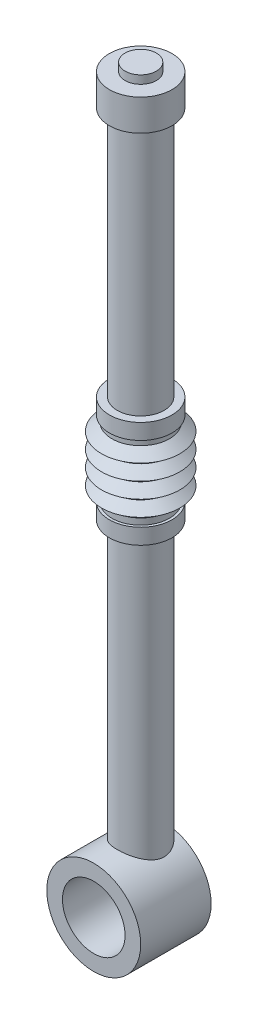
ISO-10303-21;
HEADER;
FILE_DESCRIPTION(('STEP AP214'),'2;1');
FILE_NAME('part.step','',(''),(''),'','','');
FILE_SCHEMA(('AUTOMOTIVE_DESIGN { 1 0 10303 214 1 1 1 1 }'));
ENDSEC;
DATA;
#1=APPLICATION_CONTEXT('core data for automotive mechanical design processes');
#2=APPLICATION_PROTOCOL_DEFINITION('international standard','automotive_design',2000,#1);
#3=PRODUCT_CONTEXT('',#1,'mechanical');
#4=PRODUCT('Part','Part','',(#3));
#5=PRODUCT_RELATED_PRODUCT_CATEGORY('part','',(#4));
#6=PRODUCT_DEFINITION_FORMATION('','',#4);
#7=PRODUCT_DEFINITION_CONTEXT('part definition',#1,'design');
#8=PRODUCT_DEFINITION('design','',#6,#7);
#9=PRODUCT_DEFINITION_SHAPE('','',#8);
#10=(LENGTH_UNIT() NAMED_UNIT(*) SI_UNIT(.MILLI.,.METRE.));
#11=(NAMED_UNIT(*) PLANE_ANGLE_UNIT() SI_UNIT($,.RADIAN.));
#12=(NAMED_UNIT(*) SI_UNIT($,.STERADIAN.) SOLID_ANGLE_UNIT());
#13=UNCERTAINTY_MEASURE_WITH_UNIT(LENGTH_MEASURE(1.E-05),#10,'distance_accuracy_value','');
#14=(GEOMETRIC_REPRESENTATION_CONTEXT(3) GLOBAL_UNCERTAINTY_ASSIGNED_CONTEXT((#13)) GLOBAL_UNIT_ASSIGNED_CONTEXT((#10,
#11,#12)) REPRESENTATION_CONTEXT('',''));
#15=CARTESIAN_POINT('',(0.,0.,0.));
#16=DIRECTION('',(0.,0.,1.));
#17=DIRECTION('',(1.,0.,0.));
#18=AXIS2_PLACEMENT_3D('',#15,#16,#17);
#19=CARTESIAN_POINT('',(0.,0.,-2.38125));
#20=DIRECTION('',(0.,0.,1.));
#21=DIRECTION('',(1.,0.,0.));
#22=AXIS2_PLACEMENT_3D('',#19,#20,#21);
#23=CYLINDRICAL_SURFACE('',#22,4.7625);
#24=CARTESIAN_POINT('',(0.,0.,4.7625));
#25=DIRECTION('',(0.,0.,1.));
#26=DIRECTION('',(1.,0.,0.));
#27=AXIS2_PLACEMENT_3D('',#24,#25,#26);
#28=CIRCLE('',#27,4.7625);
#29=CARTESIAN_POINT('',(4.7625,0.,4.7625));
#30=VERTEX_POINT('',#29);
#31=EDGE_CURVE('E50',#30,#30,#28,.T.);
#32=ORIENTED_EDGE('',*,*,#31,.F.);
#33=EDGE_LOOP('',(#32));
#34=FACE_BOUND('',#33,.T.);
#35=CARTESIAN_POINT('',(0.,0.,-2.38125));
#36=DIRECTION('',(0.,0.,1.));
#37=DIRECTION('',(1.,0.,0.));
#38=AXIS2_PLACEMENT_3D('',#35,#36,#37);
#39=CIRCLE('',#38,4.7625);
#40=CARTESIAN_POINT('',(0.,4.7625,-2.38125));
#41=VERTEX_POINT('',#40);
#42=EDGE_CURVE('E11',#41,#41,#39,.T.);
#43=ORIENTED_EDGE('',*,*,#42,.T.);
#44=CARTESIAN_POINT('',(0.,4.7625,2.38125));
#45=CARTESIAN_POINT('',(-0.125183914923426,4.76249216616824,2.38124079022415));
#46=CARTESIAN_POINT('',(-0.250522391801445,4.75751079676351,2.37131965241024));
#47=CARTESIAN_POINT('',(-0.497492135528296,4.73807236179371,2.33207069034315));
#48=CARTESIAN_POINT('',(-0.61911590225731,4.72359730146256,2.30270601091892));
#49=CARTESIAN_POINT('',(-0.854710283828683,4.68668758103659,2.2260071468603));
#50=CARTESIAN_POINT('',(-0.968708640458038,4.66428387601664,2.17874279663695));
#51=CARTESIAN_POINT('',(-1.18698797780686,4.6135713226785,2.06794748374516));
#52=CARTESIAN_POINT('',(-1.29126972381591,4.58526293998811,2.0044178036293));
#53=CARTESIAN_POINT('',(-1.49425297381025,4.52333339410727,1.8585245421104));
#54=CARTESIAN_POINT('',(-1.59223521685329,4.48949442770284,1.77525406928113));
#55=CARTESIAN_POINT('',(-1.77350605772424,4.42102804302336,1.59419572957401));
#56=CARTESIAN_POINT('',(-1.85678345855757,4.3864000463997,1.49639690352979));
#57=CARTESIAN_POINT('',(-2.01275632468803,4.31718127493204,1.27996152334087));
#58=CARTESIAN_POINT('',(-2.08413032991234,4.2828016396047,1.16029716565166));
#59=CARTESIAN_POINT('',(-2.2054380906532,4.22162236963736,0.90876278134485));
#60=CARTESIAN_POINT('',(-2.25538716198478,4.19481732492304,0.776901556021107));
#61=CARTESIAN_POINT('',(-2.32917787787114,4.1542779588081,0.512766217674418));
#62=CARTESIAN_POINT('',(-2.35440344714868,4.13985721707925,0.380989398503949));
#63=CARTESIAN_POINT('',(-2.38226677784078,4.12389375440723,0.114350392548179));
#64=CARTESIAN_POINT('',(-2.38492686044446,4.12233830748904,-0.0205086129467756));
#65=CARTESIAN_POINT('',(-2.36859910257368,4.13172902674897,-0.272143595403314));
#66=CARTESIAN_POINT('',(-2.35216198239562,4.14120243470123,-0.389153474350517));
#67=CARTESIAN_POINT('',(-2.30252551556825,4.16900269672528,-0.618462796693928));
#68=CARTESIAN_POINT('',(-2.26932082940667,4.1873323709318,-0.730760727258112));
#69=CARTESIAN_POINT('',(-2.18648703954377,4.23118303207826,-0.95066437192215));
#70=CARTESIAN_POINT('',(-2.13649337856986,4.25686158081143,-1.05809986210871));
#71=CARTESIAN_POINT('',(-2.02178051875954,4.31252481445096,-1.26357290922991));
#72=CARTESIAN_POINT('',(-1.95705470557847,4.3425114313283,-1.3616062166477));
#73=CARTESIAN_POINT('',(-1.80514479326104,4.40800707257198,-1.55857873309482));
#74=CARTESIAN_POINT('',(-1.71615367899184,4.44373421251251,-1.65605668020323));
#75=CARTESIAN_POINT('',(-1.5229417218779,4.51360277984095,-1.83531371551958));
#76=CARTESIAN_POINT('',(-1.41871364221752,4.54774344351895,-1.91708530103068));
#77=CARTESIAN_POINT('',(-1.19185492951209,4.61252857217558,-2.06617648032704));
#78=CARTESIAN_POINT('',(-1.06859448999609,4.6429370603578,-2.13264862501142));
#79=CARTESIAN_POINT('',(-0.810735175632698,4.69482204419958,-2.24336855040867));
#80=CARTESIAN_POINT('',(-0.676145403481687,4.71630562984336,-2.28763397806736));
#81=CARTESIAN_POINT('',(-0.411400208267049,4.74641069721793,-2.34904455510034));
#82=CARTESIAN_POINT('',(-0.281800769618209,4.75595009329994,-2.36813225512202));
#83=CARTESIAN_POINT('',(-0.0209064223793881,4.7642386329949,-2.384737891014));
#84=CARTESIAN_POINT('',(0.110387653565244,4.7629928883014,-2.38226604517899));
#85=CARTESIAN_POINT('',(0.360123514541608,4.75038401553492,-2.35694532320286));
#86=CARTESIAN_POINT('',(0.478772715418814,4.73981253794951,-2.33569065643669));
#87=CARTESIAN_POINT('',(0.710581412294078,4.71064045443463,-2.27590809129975));
#88=CARTESIAN_POINT('',(0.823740301552203,4.69203896333817,-2.23737828863266));
#89=CARTESIAN_POINT('',(1.04510349887023,4.64782498678607,-2.14312865180629));
#90=CARTESIAN_POINT('',(1.15307363286889,4.62202724713937,-2.08694881191042));
#91=CARTESIAN_POINT('',(1.35841111754757,4.56590338843347,-1.95951268074179));
#92=CARTESIAN_POINT('',(1.45577392465991,4.53557534193758,-1.88824996699537));
#93=CARTESIAN_POINT('',(1.64727181011511,4.46980202056836,-1.72459548718051));
#94=CARTESIAN_POINT('',(1.7401510102877,4.4341466953364,-1.63081604451219));
#95=CARTESIAN_POINT('',(1.90942036468315,4.36393570018444,-1.42892823352271));
#96=CARTESIAN_POINT('',(1.98579911229707,4.32938080496145,-1.32081003575388));
#97=CARTESIAN_POINT('',(2.12337947127906,4.2636565144193,-1.0866985484896));
#98=CARTESIAN_POINT('',(2.18366696159152,4.23273211084819,-0.960093172570528));
#99=CARTESIAN_POINT('',(2.28143472953946,4.18085759649541,-0.696491651629047));
#100=CARTESIAN_POINT('',(2.3189443944635,4.15989464137303,-0.559509152757374));
#101=CARTESIAN_POINT('',(2.36663314232661,4.13293324320619,-0.29310753161418));
#102=CARTESIAN_POINT('',(2.37909019428893,4.12569144386626,-0.164224683502319));
#103=CARTESIAN_POINT('',(2.3828910522584,4.12350000729882,0.0939333281807322));
#104=CARTESIAN_POINT('',(2.37424400991589,4.12854504196533,0.223208297429794));
#105=CARTESIAN_POINT('',(2.33821157512933,4.14903909044237,0.465495089724903));
#106=CARTESIAN_POINT('',(2.31268975773311,4.16345118862044,0.578883000588989));
#107=CARTESIAN_POINT('',(2.24593636258125,4.19983482171594,0.799643078320496));
#108=CARTESIAN_POINT('',(2.20469973139119,4.22180878809312,0.907013297317141));
#109=CARTESIAN_POINT('',(2.10458608148048,4.27264188427817,1.12067545046553));
#110=CARTESIAN_POINT('',(2.04471002356456,4.30186440868521,1.2264102837776));
#111=CARTESIAN_POINT('',(1.91012262489561,4.36329131541278,1.42702239668615));
#112=CARTESIAN_POINT('',(1.83540356597009,4.39549724439656,1.52189398690387));
#113=CARTESIAN_POINT('',(1.66259405491127,4.46394665051477,1.71007598397153));
#114=CARTESIAN_POINT('',(1.56276696401922,4.50020523168019,1.80179601937323));
#115=CARTESIAN_POINT('',(1.34816645613201,4.56908865882827,1.96753719658021));
#116=CARTESIAN_POINT('',(1.23338503411081,4.60171154114937,2.0415487984721));
#117=CARTESIAN_POINT('',(0.990398154568059,4.66006004858537,2.16988737295861));
#118=CARTESIAN_POINT('',(0.862103521645129,4.68573527644208,2.22407146731469));
#119=CARTESIAN_POINT('',(0.663253095567626,4.71657007779491,2.28808012549976));
#120=CARTESIAN_POINT('',(0.595951068853118,4.72556504162985,2.30653151659672));
#121=CARTESIAN_POINT('',(0.459699357941892,4.74075563729533,2.33749781582299));
#122=CARTESIAN_POINT('',(0.390750707345512,4.74695297899059,2.35001635025922));
#123=CARTESIAN_POINT('',(0.268146547102141,4.75524386229739,2.36671244235111));
#124=CARTESIAN_POINT('',(0.21470159582656,4.75795932264298,2.37215832704609));
#125=CARTESIAN_POINT('',(0.107513940854614,4.761589098815,2.37942913381609));
#126=CARTESIAN_POINT('',(0.0537712289809023,4.76250336492721,2.38125395594727));
#127=CARTESIAN_POINT('',(0.,4.7625,2.38125));
#128=B_SPLINE_CURVE_WITH_KNOTS('',3,(#44,#45,#46,#47,#48,#49,#50,#51,#52,#53,#54,#55,#56,#57,
#58,#59,#60,#61,#62,#63,#64,#65,#66,#67,#68,#69,#70,#71,#72,#73,#74,#75,#76,#77,#78,#79,#80,#81,
#82,#83,#84,#85,#86,#87,#88,#89,#90,#91,#92,#93,#94,#95,#96,#97,#98,#99,#100,#101,#102,#103,
#104,#105,#106,#107,#108,#109,#110,#111,#112,#113,#114,#115,#116,#117,#118,#119,#120,#121,#122,
#123,#124,#125,#126,#127),.UNSPECIFIED.,.T.,.F.,(4,2,2,2,2,2,2,2,2,2,2,2,2,2,2,2,2,2,2,2,2,2,2,
2,2,2,2,2,2,2,2,2,2,2,2,2,2,2,2,2,2,4),(0.,0.375342762982071,0.751399031495027,1.12600300776604,
1.50057745488486,1.89781281294745,2.29534935341367,2.7237148606323,3.15177363432781,
3.55420641408922,3.9562410713973,4.31019852674695,4.66426876848022,5.0265863440121,
5.38906691250903,5.79750891551298,6.20614554263122,6.63375821648137,7.06103054022366,
7.45291460434892,7.84461294242952,8.20595196117703,8.56733082133655,8.93904238416433,
9.31091254594483,9.71930072847022,10.127970328905,10.5564308689761,10.984337440701,
11.3711666349163,11.7578281130277,12.1076544640509,12.4575934042726,12.8310431270806,
13.2046875497327,13.6237323431551,14.0430023792659,14.4652368253627,14.6760580296016,
14.8867502080478,15.0479696796956,15.2091936010515),.UNSPECIFIED.);
#129=EDGE_CURVE('E44',#41,#41,#128,.T.);
#130=ORIENTED_EDGE('',*,*,#129,.T.);
#131=EDGE_LOOP('',(#43,#130));
#132=FACE_BOUND('',#131,.T.);
#133=ADVANCED_FACE('F33',(#34,#132),#23,.T.);
#134=CARTESIAN_POINT('',(0.,0.,-2.38125));
#135=DIRECTION('',(0.,0.,1.));
#136=DIRECTION('',(1.,0.,0.));
#137=AXIS2_PLACEMENT_3D('',#134,#135,#136);
#138=PLANE('',#137);
#139=CARTESIAN_POINT('',(0.,0.,-2.38125));
#140=DIRECTION('',(0.,0.,1.));
#141=DIRECTION('',(1.,0.,0.));
#142=AXIS2_PLACEMENT_3D('',#139,#140,#141);
#143=CIRCLE('',#142,3.175);
#144=CARTESIAN_POINT('',(3.175,0.,-2.38125));
#145=VERTEX_POINT('',#144);
#146=EDGE_CURVE('E40',#145,#145,#143,.T.);
#147=ORIENTED_EDGE('',*,*,#146,.T.);
#148=EDGE_LOOP('',(#147));
#149=FACE_BOUND('',#148,.T.);
#150=ORIENTED_EDGE('',*,*,#42,.F.);
#151=EDGE_LOOP('',(#150));
#152=FACE_BOUND('',#151,.T.);
#153=ADVANCED_FACE('F156',(#149,#152),#138,.F.);
#154=CARTESIAN_POINT('',(0.,0.,-2.38125));
#155=DIRECTION('',(0.,0.,1.));
#156=DIRECTION('',(1.,0.,0.));
#157=AXIS2_PLACEMENT_3D('',#154,#155,#156);
#158=CYLINDRICAL_SURFACE('',#157,3.175);
#159=CARTESIAN_POINT('',(0.,0.,4.7625));
#160=DIRECTION('',(0.,0.,1.));
#161=DIRECTION('',(1.,0.,0.));
#162=AXIS2_PLACEMENT_3D('',#159,#160,#161);
#163=CIRCLE('',#162,3.175);
#164=CARTESIAN_POINT('',(3.175,0.,4.7625));
#165=VERTEX_POINT('',#164);
#166=EDGE_CURVE('E47',#165,#165,#163,.T.);
#167=CARTESIAN_POINT('',(3.175,0.,-2.38125));
#168=CARTESIAN_POINT('',(3.175,0.,-2.3068359375));
#169=CARTESIAN_POINT('',(3.175,0.,-2.232421875));
#170=CARTESIAN_POINT('',(3.175,0.,-2.08359375));
#171=CARTESIAN_POINT('',(3.175,0.,-2.0091796875));
#172=CARTESIAN_POINT('',(3.175,0.,-1.8603515625));
#173=CARTESIAN_POINT('',(3.175,0.,-1.7859375));
#174=CARTESIAN_POINT('',(3.175,0.,-1.637109375));
#175=CARTESIAN_POINT('',(3.175,0.,-1.5626953125));
#176=CARTESIAN_POINT('',(3.175,0.,-1.4138671875));
#177=CARTESIAN_POINT('',(3.175,0.,-1.339453125));
#178=CARTESIAN_POINT('',(3.175,0.,-1.190625));
#179=CARTESIAN_POINT('',(3.175,0.,-1.1162109375));
#180=CARTESIAN_POINT('',(3.175,0.,-0.9673828125));
#181=CARTESIAN_POINT('',(3.175,0.,-0.89296875));
#182=CARTESIAN_POINT('',(3.175,0.,-0.744140625));
#183=CARTESIAN_POINT('',(3.175,0.,-0.6697265625));
#184=CARTESIAN_POINT('',(3.175,0.,-0.5208984375));
#185=CARTESIAN_POINT('',(3.175,0.,-0.446484375));
#186=CARTESIAN_POINT('',(3.175,0.,-0.29765625));
#187=CARTESIAN_POINT('',(3.175,0.,-0.2232421875));
#188=CARTESIAN_POINT('',(3.175,0.,-0.0744140625000002));
#189=CARTESIAN_POINT('',(3.175,0.,0.));
#190=CARTESIAN_POINT('',(3.175,0.,0.148828125));
#191=CARTESIAN_POINT('',(3.175,0.,0.2232421875));
#192=CARTESIAN_POINT('',(3.175,0.,0.3720703125));
#193=CARTESIAN_POINT('',(3.175,0.,0.446484375));
#194=CARTESIAN_POINT('',(3.175,0.,0.5953125));
#195=CARTESIAN_POINT('',(3.175,0.,0.6697265625));
#196=CARTESIAN_POINT('',(3.175,0.,0.8185546875));
#197=CARTESIAN_POINT('',(3.175,0.,0.89296875));
#198=CARTESIAN_POINT('',(3.175,0.,1.041796875));
#199=CARTESIAN_POINT('',(3.175,0.,1.1162109375));
#200=CARTESIAN_POINT('',(3.175,0.,1.2650390625));
#201=CARTESIAN_POINT('',(3.175,0.,1.339453125));
#202=CARTESIAN_POINT('',(3.175,0.,1.48828125));
#203=CARTESIAN_POINT('',(3.175,0.,1.5626953125));
#204=CARTESIAN_POINT('',(3.175,0.,1.7115234375));
#205=CARTESIAN_POINT('',(3.175,0.,1.7859375));
#206=CARTESIAN_POINT('',(3.175,0.,1.934765625));
#207=CARTESIAN_POINT('',(3.175,0.,2.0091796875));
#208=CARTESIAN_POINT('',(3.175,0.,2.1580078125));
#209=CARTESIAN_POINT('',(3.175,0.,2.232421875));
#210=CARTESIAN_POINT('',(3.175,0.,2.38125));
#211=CARTESIAN_POINT('',(3.175,0.,2.4556640625));
#212=CARTESIAN_POINT('',(3.175,0.,2.6044921875));
#213=CARTESIAN_POINT('',(3.175,0.,2.67890625));
#214=CARTESIAN_POINT('',(3.175,0.,2.827734375));
#215=CARTESIAN_POINT('',(3.175,0.,2.9021484375));
#216=CARTESIAN_POINT('',(3.175,0.,3.0509765625));
#217=CARTESIAN_POINT('',(3.175,0.,3.125390625));
#218=CARTESIAN_POINT('',(3.175,0.,3.27421875));
#219=CARTESIAN_POINT('',(3.175,0.,3.3486328125));
#220=CARTESIAN_POINT('',(3.175,0.,3.4974609375));
#221=CARTESIAN_POINT('',(3.175,0.,3.571875));
#222=CARTESIAN_POINT('',(3.175,0.,3.720703125));
#223=CARTESIAN_POINT('',(3.175,0.,3.7951171875));
#224=CARTESIAN_POINT('',(3.175,0.,3.9439453125));
#225=CARTESIAN_POINT('',(3.175,0.,4.018359375));
#226=CARTESIAN_POINT('',(3.175,0.,4.1671875));
#227=CARTESIAN_POINT('',(3.175,0.,4.2416015625));
#228=CARTESIAN_POINT('',(3.175,0.,4.3904296875));
#229=CARTESIAN_POINT('',(3.175,0.,4.46484375));
#230=CARTESIAN_POINT('',(3.175,0.,4.613671875));
#231=CARTESIAN_POINT('',(3.175,0.,4.6880859375));
#232=CARTESIAN_POINT('',(3.175,0.,4.7625));
#233=B_SPLINE_CURVE_WITH_KNOTS('',3,(#167,#168,#169,#170,#171,#172,#173,#174,#175,#176,#177,
#178,#179,#180,#181,#182,#183,#184,#185,#186,#187,#188,#189,#190,#191,#192,#193,#194,#195,#196,
#197,#198,#199,#200,#201,#202,#203,#204,#205,#206,#207,#208,#209,#210,#211,#212,#213,#214,#215,
#216,#217,#218,#219,#220,#221,#222,#223,#224,#225,#226,#227,#228,#229,#230,#231,#232),
.UNSPECIFIED.,.F.,.F.,(4,2,2,2,2,2,2,2,2,2,2,2,2,2,2,2,2,2,2,2,2,2,2,2,2,2,2,2,2,2,2,2,4),(0.,
0.2232421875,0.446484375,0.6697265625,0.89296875,1.1162109375,1.339453125,1.5626953125,
1.7859375,2.0091796875,2.232421875,2.4556640625,2.67890625,2.9021484375,3.125390625,
3.3486328125,3.571875,3.7951171875,4.018359375,4.2416015625,4.46484375,4.6880859375,4.911328125,
5.1345703125,5.3578125,5.5810546875,5.804296875,6.0275390625,6.25078125,6.4740234375,
6.697265625,6.9205078125,7.14375),.UNSPECIFIED.);
#234=EDGE_CURVE('BSEAM161',#145,#165,#233,.T.);
#235=ORIENTED_EDGE('',*,*,#146,.F.);
#236=ORIENTED_EDGE('',*,*,#166,.T.);
#237=ORIENTED_EDGE('',*,*,#234,.T.);
#238=ORIENTED_EDGE('',*,*,#234,.F.);
#239=EDGE_LOOP('',(#235,#237,#236,#238));
#240=FACE_BOUND('',#239,.T.);
#241=ADVANCED_FACE('F161',(#240),#158,.F.);
#242=CARTESIAN_POINT('',(0.,0.,4.7625));
#243=DIRECTION('',(0.,0.,1.));
#244=DIRECTION('',(1.,0.,0.));
#245=AXIS2_PLACEMENT_3D('',#242,#243,#244);
#246=PLANE('',#245);
#247=ORIENTED_EDGE('',*,*,#31,.T.);
#248=EDGE_LOOP('',(#247));
#249=FACE_BOUND('',#248,.T.);
#250=ORIENTED_EDGE('',*,*,#166,.F.);
#251=EDGE_LOOP('',(#250));
#252=FACE_BOUND('',#251,.T.);
#253=ADVANCED_FACE('F174',(#249,#252),#246,.T.);
#254=CARTESIAN_POINT('',(0.,33.3375,0.));
#255=DIRECTION('',(0.,-1.,0.));
#256=DIRECTION('',(0.,0.,-1.));
#257=AXIS2_PLACEMENT_3D('',#254,#255,#256);
#258=CYLINDRICAL_SURFACE('',#257,2.38125);
#259=CARTESIAN_POINT('',(0.,32.54375,0.));
#260=DIRECTION('',(0.,-1.,0.));
#261=DIRECTION('',(0.,0.,-1.));
#262=AXIS2_PLACEMENT_3D('',#259,#260,#261);
#263=CIRCLE('',#262,2.38125);
#264=CARTESIAN_POINT('',(0.,32.54375,-2.38125));
#265=VERTEX_POINT('',#264);
#266=EDGE_CURVE('E36',#265,#265,#263,.T.);
#267=ORIENTED_EDGE('',*,*,#266,.T.);
#268=EDGE_LOOP('',(#267));
#269=FACE_BOUND('',#268,.T.);
#270=ORIENTED_EDGE('',*,*,#129,.F.);
#271=EDGE_LOOP('',(#270));
#272=FACE_BOUND('',#271,.T.);
#273=ADVANCED_FACE('F45',(#269,#272),#258,.T.);
#274=CARTESIAN_POINT('',(0.,32.54375,0.));
#275=DIRECTION('',(0.,-1.,0.));
#276=DIRECTION('',(0.,0.,-1.));
#277=AXIS2_PLACEMENT_3D('',#274,#275,#276);
#278=CYLINDRICAL_SURFACE('',#277,3.175);
#279=CARTESIAN_POINT('',(0.,34.13125,0.));
#280=DIRECTION('',(0.,-1.,0.));
#281=DIRECTION('',(0.,0.,-1.));
#282=AXIS2_PLACEMENT_3D('',#279,#280,#281);
#283=CIRCLE('',#282,3.175);
#284=CARTESIAN_POINT('',(0.,34.13125,-3.175));
#285=VERTEX_POINT('',#284);
#286=EDGE_CURVE('E233',#285,#285,#283,.T.);
#287=ORIENTED_EDGE('',*,*,#286,.T.);
#288=EDGE_LOOP('',(#287));
#289=FACE_BOUND('',#288,.T.);
#290=CARTESIAN_POINT('',(0.,32.54375,0.));
#291=DIRECTION('',(0.,-1.,0.));
#292=DIRECTION('',(0.,0.,-1.));
#293=AXIS2_PLACEMENT_3D('',#290,#291,#292);
#294=CIRCLE('',#293,3.175);
#295=CARTESIAN_POINT('',(0.,32.54375,-3.175));
#296=VERTEX_POINT('',#295);
#297=EDGE_CURVE('E53',#296,#296,#294,.T.);
#298=ORIENTED_EDGE('',*,*,#297,.F.);
#299=EDGE_LOOP('',(#298));
#300=FACE_BOUND('',#299,.T.);
#301=ADVANCED_FACE('F65',(#289,#300),#278,.T.);
#302=CARTESIAN_POINT('',(0.,32.54375,0.));
#303=DIRECTION('',(0.,-1.,0.));
#304=DIRECTION('',(0.,0.,-1.));
#305=AXIS2_PLACEMENT_3D('',#302,#303,#304);
#306=PLANE('',#305);
#307=ORIENTED_EDGE('',*,*,#266,.F.);
#308=EDGE_LOOP('',(#307));
#309=FACE_BOUND('',#308,.T.);
#310=ORIENTED_EDGE('',*,*,#297,.T.);
#311=EDGE_LOOP('',(#310));
#312=FACE_BOUND('',#311,.T.);
#313=ADVANCED_FACE('F68',(#309,#312),#306,.T.);
#314=CARTESIAN_POINT('',(0.,43.33875,0.));
#315=DIRECTION('',(0.,1.,0.));
#316=DIRECTION('',(0.,0.,1.));
#317=AXIS2_PLACEMENT_3D('',#314,#315,#316);
#318=PLANE('',#317);
#319=CARTESIAN_POINT('',(0.,43.33875,0.));
#320=DIRECTION('',(0.,1.,0.));
#321=DIRECTION('',(0.,0.,1.));
#322=AXIS2_PLACEMENT_3D('',#319,#320,#321);
#323=CIRCLE('',#322,2.38125);
#324=CARTESIAN_POINT('',(0.,43.33875,2.38125));
#325=VERTEX_POINT('',#324);
#326=EDGE_CURVE('E237',#325,#325,#323,.T.);
#327=ORIENTED_EDGE('',*,*,#326,.F.);
#328=EDGE_LOOP('',(#327));
#329=FACE_BOUND('',#328,.T.);
#330=CARTESIAN_POINT('',(0.,43.33875,0.));
#331=DIRECTION('',(0.,-1.,0.));
#332=DIRECTION('',(0.,0.,-1.));
#333=AXIS2_PLACEMENT_3D('',#330,#331,#332);
#334=CIRCLE('',#333,3.175);
#335=CARTESIAN_POINT('',(0.,43.33875,-3.175));
#336=VERTEX_POINT('',#335);
#337=EDGE_CURVE('E193',#336,#336,#334,.T.);
#338=ORIENTED_EDGE('',*,*,#337,.F.);
#339=EDGE_LOOP('',(#338));
#340=FACE_BOUND('',#339,.T.);
#341=ADVANCED_FACE('F72',(#329,#340),#318,.T.);
#342=CARTESIAN_POINT('',(0.,32.54375,0.));
#343=DIRECTION('',(0.,-1.,0.));
#344=DIRECTION('',(0.,0.,-1.));
#345=AXIS2_PLACEMENT_3D('',#342,#343,#344);
#346=CYLINDRICAL_SURFACE('',#345,3.175);
#347=ORIENTED_EDGE('',*,*,#337,.T.);
#348=EDGE_LOOP('',(#347));
#349=FACE_BOUND('',#348,.T.);
#350=CARTESIAN_POINT('',(0.,41.75125,0.));
#351=DIRECTION('',(0.,-1.,0.));
#352=DIRECTION('',(0.,0.,-1.));
#353=AXIS2_PLACEMENT_3D('',#350,#351,#352);
#354=CIRCLE('',#353,3.175);
#355=CARTESIAN_POINT('',(0.,41.75125,-3.175));
#356=VERTEX_POINT('',#355);
#357=EDGE_CURVE('E195',#356,#356,#354,.T.);
#358=ORIENTED_EDGE('',*,*,#357,.F.);
#359=EDGE_LOOP('',(#358));
#360=FACE_BOUND('',#359,.T.);
#361=ADVANCED_FACE('F76',(#349,#360),#346,.T.);
#362=CARTESIAN_POINT('',(0.,41.75125,0.));
#363=DIRECTION('',(0.,-1.,0.));
#364=DIRECTION('',(0.,0.,-1.));
#365=AXIS2_PLACEMENT_3D('',#362,#363,#364);
#366=PLANE('',#365);
#367=ORIENTED_EDGE('',*,*,#357,.T.);
#368=EDGE_LOOP('',(#367));
#369=FACE_BOUND('',#368,.T.);
#370=CARTESIAN_POINT('',(0.,41.75125,0.));
#371=DIRECTION('',(0.,-1.,0.));
#372=DIRECTION('',(0.,0.,-1.));
#373=AXIS2_PLACEMENT_3D('',#370,#371,#372);
#374=CIRCLE('',#373,2.921);
#375=CARTESIAN_POINT('',(0.,41.75125,-2.921));
#376=VERTEX_POINT('',#375);
#377=EDGE_CURVE('E198',#376,#376,#374,.T.);
#378=ORIENTED_EDGE('',*,*,#377,.F.);
#379=EDGE_LOOP('',(#378));
#380=FACE_BOUND('',#379,.T.);
#381=ADVANCED_FACE('F80',(#369,#380),#366,.T.);
#382=CARTESIAN_POINT('',(0.,32.54375,0.));
#383=DIRECTION('',(0.,-1.,0.));
#384=DIRECTION('',(0.,0.,-1.));
#385=AXIS2_PLACEMENT_3D('',#382,#383,#384);
#386=CYLINDRICAL_SURFACE('',#385,2.921);
#387=ORIENTED_EDGE('',*,*,#377,.T.);
#388=EDGE_LOOP('',(#387));
#389=FACE_BOUND('',#388,.T.);
#390=CARTESIAN_POINT('',(0.,41.11625,0.));
#391=DIRECTION('',(0.,-1.,0.));
#392=DIRECTION('',(0.,0.,-1.));
#393=AXIS2_PLACEMENT_3D('',#390,#391,#392);
#394=CIRCLE('',#393,2.921);
#395=CARTESIAN_POINT('',(0.,41.11625,-2.921));
#396=VERTEX_POINT('',#395);
#397=EDGE_CURVE('E203',#396,#396,#394,.T.);
#398=ORIENTED_EDGE('',*,*,#397,.F.);
#399=EDGE_LOOP('',(#398));
#400=FACE_BOUND('',#399,.T.);
#401=ADVANCED_FACE('F84',(#389,#400),#386,.T.);
#402=CARTESIAN_POINT('',(0.,40.3225,0.));
#403=DIRECTION('',(0.,-1.,0.));
#404=DIRECTION('',(0.,0.,-1.));
#405=AXIS2_PLACEMENT_3D('',#402,#403,#404);
#406=CONICAL_SURFACE('',#405,3.96874999999999,0.922464337707633);
#407=ORIENTED_EDGE('',*,*,#397,.T.);
#408=EDGE_LOOP('',(#407));
#409=FACE_BOUND('',#408,.T.);
#410=CARTESIAN_POINT('',(0.,40.3225,0.));
#411=DIRECTION('',(0.,-1.,0.));
#412=DIRECTION('',(0.,0.,-1.));
#413=AXIS2_PLACEMENT_3D('',#410,#411,#412);
#414=CIRCLE('',#413,3.96874999999999);
#415=CARTESIAN_POINT('',(0.,40.3225,-3.96874999999999));
#416=VERTEX_POINT('',#415);
#417=EDGE_CURVE('E206',#416,#416,#414,.T.);
#418=ORIENTED_EDGE('',*,*,#417,.F.);
#419=EDGE_LOOP('',(#418));
#420=FACE_BOUND('',#419,.T.);
#421=ADVANCED_FACE('F88',(#409,#420),#406,.T.);
#422=CARTESIAN_POINT('',(0.,39.52875,0.));
#423=DIRECTION('',(0.,1.,0.));
#424=DIRECTION('',(0.,0.,1.));
#425=AXIS2_PLACEMENT_3D('',#422,#423,#424);
#426=CONICAL_SURFACE('',#425,2.921,0.922464337707645);
#427=ORIENTED_EDGE('',*,*,#417,.T.);
#428=EDGE_LOOP('',(#427));
#429=FACE_BOUND('',#428,.T.);
#430=CARTESIAN_POINT('',(0.,39.52875,0.));
#431=DIRECTION('',(0.,-1.,0.));
#432=DIRECTION('',(0.,0.,-1.));
#433=AXIS2_PLACEMENT_3D('',#430,#431,#432);
#434=CIRCLE('',#433,2.921);
#435=CARTESIAN_POINT('',(0.,39.52875,-2.921));
#436=VERTEX_POINT('',#435);
#437=EDGE_CURVE('E209',#436,#436,#434,.T.);
#438=ORIENTED_EDGE('',*,*,#437,.F.);
#439=EDGE_LOOP('',(#438));
#440=FACE_BOUND('',#439,.T.);
#441=ADVANCED_FACE('F92',(#429,#440),#426,.T.);
#442=CARTESIAN_POINT('',(0.,38.735,0.));
#443=DIRECTION('',(0.,-1.,0.));
#444=DIRECTION('',(0.,0.,-1.));
#445=AXIS2_PLACEMENT_3D('',#442,#443,#444);
#446=CONICAL_SURFACE('',#445,3.96875,0.922464337707637);
#447=ORIENTED_EDGE('',*,*,#437,.T.);
#448=EDGE_LOOP('',(#447));
#449=FACE_BOUND('',#448,.T.);
#450=CARTESIAN_POINT('',(0.,38.735,0.));
#451=DIRECTION('',(0.,-1.,0.));
#452=DIRECTION('',(0.,0.,-1.));
#453=AXIS2_PLACEMENT_3D('',#450,#451,#452);
#454=CIRCLE('',#453,3.96875);
#455=CARTESIAN_POINT('',(0.,38.735,-3.96875));
#456=VERTEX_POINT('',#455);
#457=EDGE_CURVE('E212',#456,#456,#454,.T.);
#458=ORIENTED_EDGE('',*,*,#457,.F.);
#459=EDGE_LOOP('',(#458));
#460=FACE_BOUND('',#459,.T.);
#461=ADVANCED_FACE('F96',(#449,#460),#446,.T.);
#462=CARTESIAN_POINT('',(0.,37.94125,0.));
#463=DIRECTION('',(0.,1.,0.));
#464=DIRECTION('',(0.,0.,1.));
#465=AXIS2_PLACEMENT_3D('',#462,#463,#464);
#466=CONICAL_SURFACE('',#465,2.921,0.92246433770763);
#467=ORIENTED_EDGE('',*,*,#457,.T.);
#468=EDGE_LOOP('',(#467));
#469=FACE_BOUND('',#468,.T.);
#470=CARTESIAN_POINT('',(0.,37.94125,0.));
#471=DIRECTION('',(0.,-1.,0.));
#472=DIRECTION('',(0.,0.,-1.));
#473=AXIS2_PLACEMENT_3D('',#470,#471,#472);
#474=CIRCLE('',#473,2.921);
#475=CARTESIAN_POINT('',(0.,37.94125,-2.921));
#476=VERTEX_POINT('',#475);
#477=EDGE_CURVE('E215',#476,#476,#474,.T.);
#478=ORIENTED_EDGE('',*,*,#477,.F.);
#479=EDGE_LOOP('',(#478));
#480=FACE_BOUND('',#479,.T.);
#481=ADVANCED_FACE('F100',(#469,#480),#466,.T.);
#482=CARTESIAN_POINT('',(0.,37.1475,0.));
#483=DIRECTION('',(0.,-1.,0.));
#484=DIRECTION('',(0.,0.,-1.));
#485=AXIS2_PLACEMENT_3D('',#482,#483,#484);
#486=CONICAL_SURFACE('',#485,3.96875,0.922464337707645);
#487=ORIENTED_EDGE('',*,*,#477,.T.);
#488=EDGE_LOOP('',(#487));
#489=FACE_BOUND('',#488,.T.);
#490=CARTESIAN_POINT('',(0.,37.1475,0.));
#491=DIRECTION('',(0.,-1.,0.));
#492=DIRECTION('',(0.,0.,-1.));
#493=AXIS2_PLACEMENT_3D('',#490,#491,#492);
#494=CIRCLE('',#493,3.96875);
#495=CARTESIAN_POINT('',(0.,37.1475,-3.96875));
#496=VERTEX_POINT('',#495);
#497=EDGE_CURVE('E218',#496,#496,#494,.T.);
#498=ORIENTED_EDGE('',*,*,#497,.F.);
#499=EDGE_LOOP('',(#498));
#500=FACE_BOUND('',#499,.T.);
#501=ADVANCED_FACE('F104',(#489,#500),#486,.T.);
#502=CARTESIAN_POINT('',(0.,36.35375,0.));
#503=DIRECTION('',(0.,1.,0.));
#504=DIRECTION('',(0.,0.,1.));
#505=AXIS2_PLACEMENT_3D('',#502,#503,#504);
#506=CONICAL_SURFACE('',#505,2.921,0.92246433770763);
#507=ORIENTED_EDGE('',*,*,#497,.T.);
#508=EDGE_LOOP('',(#507));
#509=FACE_BOUND('',#508,.T.);
#510=CARTESIAN_POINT('',(0.,36.35375,0.));
#511=DIRECTION('',(0.,-1.,0.));
#512=DIRECTION('',(0.,0.,-1.));
#513=AXIS2_PLACEMENT_3D('',#510,#511,#512);
#514=CIRCLE('',#513,2.921);
#515=CARTESIAN_POINT('',(0.,36.35375,-2.921));
#516=VERTEX_POINT('',#515);
#517=EDGE_CURVE('E221',#516,#516,#514,.T.);
#518=ORIENTED_EDGE('',*,*,#517,.F.);
#519=EDGE_LOOP('',(#518));
#520=FACE_BOUND('',#519,.T.);
#521=ADVANCED_FACE('F108',(#509,#520),#506,.T.);
#522=CARTESIAN_POINT('',(0.,35.56,0.));
#523=DIRECTION('',(0.,-1.,0.));
#524=DIRECTION('',(0.,0.,-1.));
#525=AXIS2_PLACEMENT_3D('',#522,#523,#524);
#526=CONICAL_SURFACE('',#525,3.96875,0.92246433770764);
#527=ORIENTED_EDGE('',*,*,#517,.T.);
#528=EDGE_LOOP('',(#527));
#529=FACE_BOUND('',#528,.T.);
#530=CARTESIAN_POINT('',(0.,35.56,0.));
#531=DIRECTION('',(0.,-1.,0.));
#532=DIRECTION('',(0.,0.,-1.));
#533=AXIS2_PLACEMENT_3D('',#530,#531,#532);
#534=CIRCLE('',#533,3.96875);
#535=CARTESIAN_POINT('',(0.,35.56,-3.96875));
#536=VERTEX_POINT('',#535);
#537=EDGE_CURVE('E224',#536,#536,#534,.T.);
#538=ORIENTED_EDGE('',*,*,#537,.F.);
#539=EDGE_LOOP('',(#538));
#540=FACE_BOUND('',#539,.T.);
#541=ADVANCED_FACE('F112',(#529,#540),#526,.T.);
#542=CARTESIAN_POINT('',(0.,34.76625,0.));
#543=DIRECTION('',(0.,1.,0.));
#544=DIRECTION('',(0.,0.,1.));
#545=AXIS2_PLACEMENT_3D('',#542,#543,#544);
#546=CONICAL_SURFACE('',#545,2.921,0.92246433770764);
#547=ORIENTED_EDGE('',*,*,#537,.T.);
#548=EDGE_LOOP('',(#547));
#549=FACE_BOUND('',#548,.T.);
#550=CARTESIAN_POINT('',(0.,34.76625,0.));
#551=DIRECTION('',(0.,-1.,0.));
#552=DIRECTION('',(0.,0.,-1.));
#553=AXIS2_PLACEMENT_3D('',#550,#551,#552);
#554=CIRCLE('',#553,2.921);
#555=CARTESIAN_POINT('',(0.,34.76625,-2.921));
#556=VERTEX_POINT('',#555);
#557=EDGE_CURVE('E227',#556,#556,#554,.T.);
#558=ORIENTED_EDGE('',*,*,#557,.F.);
#559=EDGE_LOOP('',(#558));
#560=FACE_BOUND('',#559,.T.);
#561=ADVANCED_FACE('F116',(#549,#560),#546,.T.);
#562=CARTESIAN_POINT('',(0.,32.54375,0.));
#563=DIRECTION('',(0.,-1.,0.));
#564=DIRECTION('',(0.,0.,-1.));
#565=AXIS2_PLACEMENT_3D('',#562,#563,#564);
#566=CYLINDRICAL_SURFACE('',#565,2.921);
#567=ORIENTED_EDGE('',*,*,#557,.T.);
#568=EDGE_LOOP('',(#567));
#569=FACE_BOUND('',#568,.T.);
#570=CARTESIAN_POINT('',(0.,34.13125,0.));
#571=DIRECTION('',(0.,-1.,0.));
#572=DIRECTION('',(0.,0.,-1.));
#573=AXIS2_PLACEMENT_3D('',#570,#571,#572);
#574=CIRCLE('',#573,2.921);
#575=CARTESIAN_POINT('',(0.,34.13125,-2.921));
#576=VERTEX_POINT('',#575);
#577=EDGE_CURVE('E230',#576,#576,#574,.T.);
#578=ORIENTED_EDGE('',*,*,#577,.F.);
#579=EDGE_LOOP('',(#578));
#580=FACE_BOUND('',#579,.T.);
#581=ADVANCED_FACE('F120',(#569,#580),#566,.T.);
#582=CARTESIAN_POINT('',(0.,34.13125,0.));
#583=DIRECTION('',(0.,-1.,0.));
#584=DIRECTION('',(0.,0.,-1.));
#585=AXIS2_PLACEMENT_3D('',#582,#583,#584);
#586=PLANE('',#585);
#587=ORIENTED_EDGE('',*,*,#286,.F.);
#588=EDGE_LOOP('',(#587));
#589=FACE_BOUND('',#588,.T.);
#590=ORIENTED_EDGE('',*,*,#577,.T.);
#591=EDGE_LOOP('',(#590));
#592=FACE_BOUND('',#591,.T.);
#593=ADVANCED_FACE('F124',(#589,#592),#586,.F.);
#594=CARTESIAN_POINT('',(0.,68.73875,0.));
#595=DIRECTION('',(0.,-1.,0.));
#596=DIRECTION('',(0.,0.,-1.));
#597=AXIS2_PLACEMENT_3D('',#594,#595,#596);
#598=CYLINDRICAL_SURFACE('',#597,2.38125);
#599=CARTESIAN_POINT('',(0.,68.73875,0.));
#600=DIRECTION('',(0.,1.,0.));
#601=DIRECTION('',(0.,0.,1.));
#602=AXIS2_PLACEMENT_3D('',#599,#600,#601);
#603=CIRCLE('',#602,2.38125);
#604=CARTESIAN_POINT('',(0.,68.73875,2.38125));
#605=VERTEX_POINT('',#604);
#606=EDGE_CURVE('E236',#605,#605,#603,.T.);
#607=ORIENTED_EDGE('',*,*,#606,.F.);
#608=EDGE_LOOP('',(#607));
#609=FACE_BOUND('',#608,.T.);
#610=ORIENTED_EDGE('',*,*,#326,.T.);
#611=EDGE_LOOP('',(#610));
#612=FACE_BOUND('',#611,.T.);
#613=ADVANCED_FACE('F128',(#609,#612),#598,.T.);
#614=CARTESIAN_POINT('',(0.,71.91375,0.));
#615=DIRECTION('',(0.,-1.,0.));
#616=DIRECTION('',(0.,0.,-1.));
#617=AXIS2_PLACEMENT_3D('',#614,#615,#616);
#618=CYLINDRICAL_SURFACE('',#617,3.175);
#619=CARTESIAN_POINT('',(0.,71.91375,0.));
#620=DIRECTION('',(0.,1.,0.));
#621=DIRECTION('',(0.,0.,1.));
#622=AXIS2_PLACEMENT_3D('',#619,#620,#621);
#623=CIRCLE('',#622,3.175);
#624=CARTESIAN_POINT('',(0.,71.91375,3.175));
#625=VERTEX_POINT('',#624);
#626=EDGE_CURVE('E240',#625,#625,#623,.T.);
#627=ORIENTED_EDGE('',*,*,#626,.F.);
#628=EDGE_LOOP('',(#627));
#629=FACE_BOUND('',#628,.T.);
#630=CARTESIAN_POINT('',(0.,68.73875,0.));
#631=DIRECTION('',(0.,1.,0.));
#632=DIRECTION('',(0.,0.,1.));
#633=AXIS2_PLACEMENT_3D('',#630,#631,#632);
#634=CIRCLE('',#633,3.175);
#635=CARTESIAN_POINT('',(0.,68.73875,3.175));
#636=VERTEX_POINT('',#635);
#637=EDGE_CURVE('E243',#636,#636,#634,.T.);
#638=ORIENTED_EDGE('',*,*,#637,.T.);
#639=EDGE_LOOP('',(#638));
#640=FACE_BOUND('',#639,.T.);
#641=ADVANCED_FACE('F132',(#629,#640),#618,.T.);
#642=CARTESIAN_POINT('',(0.,71.91375,0.));
#643=DIRECTION('',(0.,1.,0.));
#644=DIRECTION('',(0.,0.,1.));
#645=AXIS2_PLACEMENT_3D('',#642,#643,#644);
#646=PLANE('',#645);
#647=CARTESIAN_POINT('',(0.,71.91375,0.));
#648=DIRECTION('',(0.,1.,0.));
#649=DIRECTION('',(0.,0.,1.));
#650=AXIS2_PLACEMENT_3D('',#647,#648,#649);
#651=CIRCLE('',#650,1.5875);
#652=CARTESIAN_POINT('',(0.,71.91375,1.5875));
#653=VERTEX_POINT('',#652);
#654=EDGE_CURVE('E249',#653,#653,#651,.T.);
#655=ORIENTED_EDGE('',*,*,#654,.F.);
#656=EDGE_LOOP('',(#655));
#657=FACE_BOUND('',#656,.T.);
#658=ORIENTED_EDGE('',*,*,#626,.T.);
#659=EDGE_LOOP('',(#658));
#660=FACE_BOUND('',#659,.T.);
#661=ADVANCED_FACE('F136',(#657,#660),#646,.T.);
#662=CARTESIAN_POINT('',(0.,68.73875,0.));
#663=DIRECTION('',(0.,1.,0.));
#664=DIRECTION('',(0.,0.,1.));
#665=AXIS2_PLACEMENT_3D('',#662,#663,#664);
#666=PLANE('',#665);
#667=ORIENTED_EDGE('',*,*,#606,.T.);
#668=EDGE_LOOP('',(#667));
#669=FACE_BOUND('',#668,.T.);
#670=ORIENTED_EDGE('',*,*,#637,.F.);
#671=EDGE_LOOP('',(#670));
#672=FACE_BOUND('',#671,.T.);
#673=ADVANCED_FACE('F138',(#669,#672),#666,.F.);
#674=CARTESIAN_POINT('',(0.,72.7456,0.));
#675=DIRECTION('',(0.,-1.,0.));
#676=DIRECTION('',(0.,0.,-1.));
#677=AXIS2_PLACEMENT_3D('',#674,#675,#676);
#678=CYLINDRICAL_SURFACE('',#677,1.5875);
#679=CARTESIAN_POINT('',(0.,72.7456,0.));
#680=DIRECTION('',(0.,1.,0.));
#681=DIRECTION('',(0.,0.,1.));
#682=AXIS2_PLACEMENT_3D('',#679,#680,#681);
#683=CIRCLE('',#682,1.5875);
#684=CARTESIAN_POINT('',(0.,72.7456,1.5875));
#685=VERTEX_POINT('',#684);
#686=EDGE_CURVE('E246',#685,#685,#683,.T.);
#687=ORIENTED_EDGE('',*,*,#686,.F.);
#688=EDGE_LOOP('',(#687));
#689=FACE_BOUND('',#688,.T.);
#690=ORIENTED_EDGE('',*,*,#654,.T.);
#691=EDGE_LOOP('',(#690));
#692=FACE_BOUND('',#691,.T.);
#693=ADVANCED_FACE('F141',(#689,#692),#678,.T.);
#694=CARTESIAN_POINT('',(0.,72.7456,0.));
#695=DIRECTION('',(0.,1.,0.));
#696=DIRECTION('',(0.,0.,1.));
#697=AXIS2_PLACEMENT_3D('',#694,#695,#696);
#698=PLANE('',#697);
#699=ORIENTED_EDGE('',*,*,#686,.T.);
#700=EDGE_LOOP('',(#699));
#701=FACE_BOUND('',#700,.T.);
#702=ADVANCED_FACE('F148',(#701),#698,.T.);
#703=CLOSED_SHELL('',(#133,#153,#241,#253,#273,#301,#313,#341,#361,#381,#401,#421,#441,#461,
#481,#501,#521,#541,#561,#581,#593,#613,#641,#661,#673,#693,#702));
#704=MANIFOLD_SOLID_BREP('B2',#703);
#705=ADVANCED_BREP_SHAPE_REPRESENTATION('',(#18,#704),#14);
#706=SHAPE_DEFINITION_REPRESENTATION(#9,#705);
ENDSEC;
END-ISO-10303-21;
